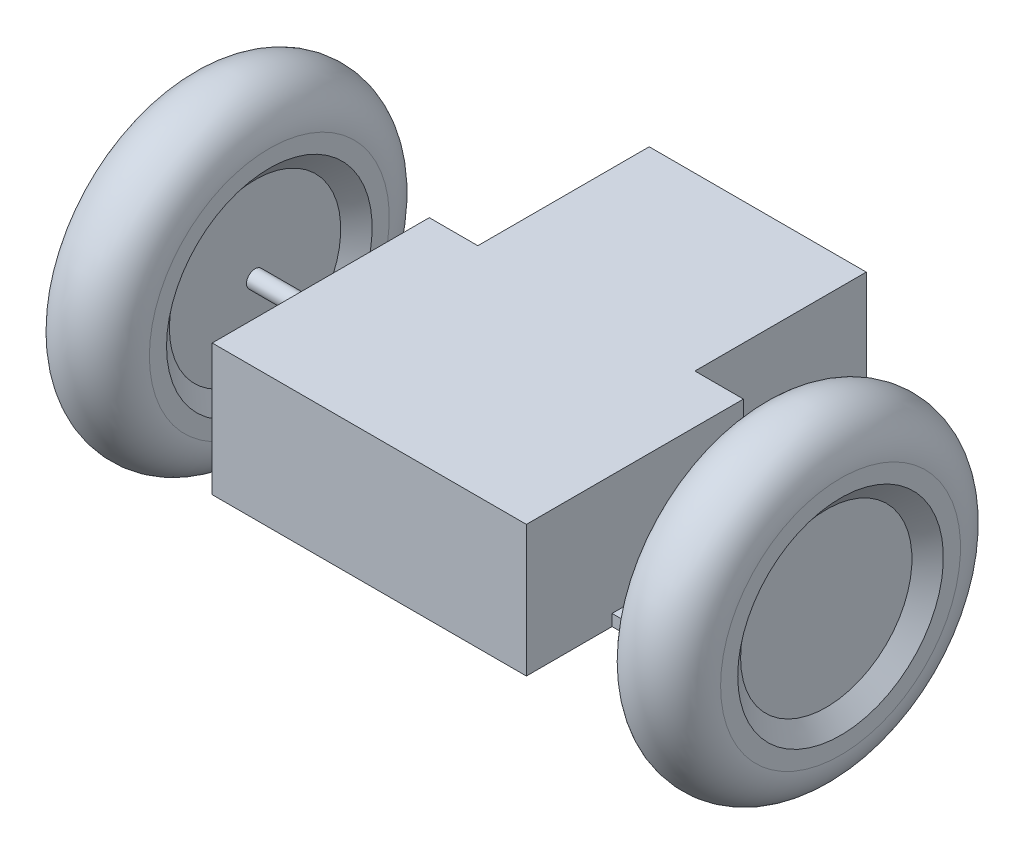
ISO-10303-21;
HEADER;
FILE_DESCRIPTION(('STEP AP214'),'2;1');
FILE_NAME('part.step','',(''),(''),'','','');
FILE_SCHEMA(('AUTOMOTIVE_DESIGN { 1 0 10303 214 1 1 1 1 }'));
ENDSEC;
DATA;
#1=APPLICATION_CONTEXT('core data for automotive mechanical design processes');
#2=APPLICATION_PROTOCOL_DEFINITION('international standard','automotive_design',2000,#1);
#3=PRODUCT_CONTEXT('',#1,'mechanical');
#4=PRODUCT('Part','Part','',(#3));
#5=PRODUCT_RELATED_PRODUCT_CATEGORY('part','',(#4));
#6=PRODUCT_DEFINITION_FORMATION('','',#4);
#7=PRODUCT_DEFINITION_CONTEXT('part definition',#1,'design');
#8=PRODUCT_DEFINITION('design','',#6,#7);
#9=PRODUCT_DEFINITION_SHAPE('','',#8);
#10=(LENGTH_UNIT() NAMED_UNIT(*) SI_UNIT(.MILLI.,.METRE.));
#11=(NAMED_UNIT(*) PLANE_ANGLE_UNIT() SI_UNIT($,.RADIAN.));
#12=(NAMED_UNIT(*) SI_UNIT($,.STERADIAN.) SOLID_ANGLE_UNIT());
#13=UNCERTAINTY_MEASURE_WITH_UNIT(LENGTH_MEASURE(1.E-05),#10,'distance_accuracy_value','');
#14=(GEOMETRIC_REPRESENTATION_CONTEXT(3) GLOBAL_UNCERTAINTY_ASSIGNED_CONTEXT((#13)) GLOBAL_UNIT_ASSIGNED_CONTEXT((#10,
#11,#12)) REPRESENTATION_CONTEXT('',''));
#15=CARTESIAN_POINT('',(0.,0.,0.));
#16=DIRECTION('',(0.,0.,1.));
#17=DIRECTION('',(1.,0.,0.));
#18=AXIS2_PLACEMENT_3D('',#15,#16,#17);
#19=CARTESIAN_POINT('',(27.5,-11.5,-34.));
#20=DIRECTION('',(1.,0.,0.));
#21=DIRECTION('',(0.,0.,-1.));
#22=AXIS2_PLACEMENT_3D('',#19,#20,#21);
#23=PLANE('',#22);
#24=DIRECTION('',(0.,-1.,0.));
#25=VECTOR('',#24,1.);
#26=CARTESIAN_POINT('',(27.5,-9.5,19.));
#27=LINE('',#26,#25);
#28=CARTESIAN_POINT('',(27.5,-9.5,19.));
#29=VERTEX_POINT('',#28);
#30=CARTESIAN_POINT('',(27.5,-11.5,19.));
#31=VERTEX_POINT('',#30);
#32=EDGE_CURVE('E56',#29,#31,#27,.T.);
#33=ORIENTED_EDGE('',*,*,#32,.F.);
#34=DIRECTION('',(0.,0.,-1.));
#35=VECTOR('',#34,1.);
#36=CARTESIAN_POINT('',(27.5,-9.5,19.));
#37=LINE('',#36,#35);
#38=CARTESIAN_POINT('',(27.5,-9.5,11.));
#39=VERTEX_POINT('',#38);
#40=EDGE_CURVE('E51',#29,#39,#37,.T.);
#41=ORIENTED_EDGE('',*,*,#40,.T.);
#42=DIRECTION('',(0.,-1.,0.));
#43=VECTOR('',#42,1.);
#44=CARTESIAN_POINT('',(27.5,-9.5,11.));
#45=LINE('',#44,#43);
#46=CARTESIAN_POINT('',(27.5,-11.5,11.));
#47=VERTEX_POINT('',#46);
#48=EDGE_CURVE('E160',#39,#47,#45,.T.);
#49=ORIENTED_EDGE('',*,*,#48,.T.);
#50=DIRECTION('',(0.,0.,-1.));
#51=VECTOR('',#50,1.);
#52=CARTESIAN_POINT('',(27.5,-11.5,-34.));
#53=LINE('',#52,#51);
#54=CARTESIAN_POINT('',(27.5,-11.5,-4.00000000000001));
#55=VERTEX_POINT('',#54);
#56=EDGE_CURVE('E315',#47,#55,#53,.T.);
#57=ORIENTED_EDGE('',*,*,#56,.T.);
#58=DIRECTION('',(0.,1.,0.));
#59=VECTOR('',#58,1.);
#60=CARTESIAN_POINT('',(27.5,-28.5,-4.00000000000001));
#61=LINE('',#60,#59);
#62=CARTESIAN_POINT('',(27.5,11.5,-4.00000000000001));
#63=VERTEX_POINT('',#62);
#64=EDGE_CURVE('E227',#55,#63,#61,.T.);
#65=ORIENTED_EDGE('',*,*,#64,.T.);
#66=DIRECTION('',(0.,0.,-1.));
#67=VECTOR('',#66,1.);
#68=CARTESIAN_POINT('',(27.5,11.5,-34.));
#69=LINE('',#68,#67);
#70=CARTESIAN_POINT('',(27.5,11.5,34.));
#71=VERTEX_POINT('',#70);
#72=EDGE_CURVE('E304',#71,#63,#69,.T.);
#73=ORIENTED_EDGE('',*,*,#72,.F.);
#74=DIRECTION('',(0.,1.,0.));
#75=VECTOR('',#74,1.);
#76=CARTESIAN_POINT('',(27.5,-11.5,34.));
#77=LINE('',#76,#75);
#78=CARTESIAN_POINT('',(27.5,-11.5,34.));
#79=VERTEX_POINT('',#78);
#80=EDGE_CURVE('E44',#79,#71,#77,.T.);
#81=ORIENTED_EDGE('',*,*,#80,.F.);
#82=EDGE_CURVE('E316',#79,#31,#53,.T.);
#83=ORIENTED_EDGE('',*,*,#82,.T.);
#84=EDGE_LOOP('',(#33,#41,#49,#57,#65,#73,#81,#83));
#85=FACE_BOUND('',#84,.T.);
#86=CARTESIAN_POINT('',(27.5,0.,9.));
#87=DIRECTION('',(1.,0.,0.));
#88=DIRECTION('',(0.,0.,-1.));
#89=AXIS2_PLACEMENT_3D('',#86,#87,#88);
#90=CIRCLE('',#89,1.5);
#91=CARTESIAN_POINT('',(27.5,0.,7.5));
#92=VERTEX_POINT('',#91);
#93=EDGE_CURVE('E296',#92,#92,#90,.T.);
#94=ORIENTED_EDGE('',*,*,#93,.F.);
#95=EDGE_LOOP('',(#94));
#96=FACE_BOUND('',#95,.T.);
#97=ADVANCED_FACE('F36',(#85,#96),#23,.T.);
#98=CARTESIAN_POINT('',(-27.5,-11.5,-34.));
#99=DIRECTION('',(-1.,0.,0.));
#100=DIRECTION('',(0.,0.,1.));
#101=AXIS2_PLACEMENT_3D('',#98,#99,#100);
#102=PLANE('',#101);
#103=DIRECTION('',(0.,-1.,0.));
#104=VECTOR('',#103,1.);
#105=CARTESIAN_POINT('',(-27.5,-9.5,11.));
#106=LINE('',#105,#104);
#107=CARTESIAN_POINT('',(-27.5,-9.5,11.));
#108=VERTEX_POINT('',#107);
#109=CARTESIAN_POINT('',(-27.5,-11.5,11.));
#110=VERTEX_POINT('',#109);
#111=EDGE_CURVE('E212',#108,#110,#106,.T.);
#112=ORIENTED_EDGE('',*,*,#111,.F.);
#113=DIRECTION('',(0.,0.,1.));
#114=VECTOR('',#113,1.);
#115=CARTESIAN_POINT('',(-27.5,-9.5,19.));
#116=LINE('',#115,#114);
#117=CARTESIAN_POINT('',(-27.5,-9.5,19.));
#118=VERTEX_POINT('',#117);
#119=EDGE_CURVE('E192',#108,#118,#116,.T.);
#120=ORIENTED_EDGE('',*,*,#119,.T.);
#121=DIRECTION('',(0.,-1.,0.));
#122=VECTOR('',#121,1.);
#123=CARTESIAN_POINT('',(-27.5,-9.5,19.));
#124=LINE('',#123,#122);
#125=CARTESIAN_POINT('',(-27.5,-11.5,19.));
#126=VERTEX_POINT('',#125);
#127=EDGE_CURVE('E204',#118,#126,#124,.T.);
#128=ORIENTED_EDGE('',*,*,#127,.T.);
#129=DIRECTION('',(0.,0.,1.));
#130=VECTOR('',#129,1.);
#131=CARTESIAN_POINT('',(-27.5,-11.5,-34.));
#132=LINE('',#131,#130);
#133=CARTESIAN_POINT('',(-27.5,-11.5,34.));
#134=VERTEX_POINT('',#133);
#135=EDGE_CURVE('E309',#126,#134,#132,.T.);
#136=ORIENTED_EDGE('',*,*,#135,.T.);
#137=DIRECTION('',(0.,1.,0.));
#138=VECTOR('',#137,1.);
#139=CARTESIAN_POINT('',(-27.5,-11.5,34.));
#140=LINE('',#139,#138);
#141=CARTESIAN_POINT('',(-27.5,11.5,34.));
#142=VERTEX_POINT('',#141);
#143=EDGE_CURVE('E320',#134,#142,#140,.T.);
#144=ORIENTED_EDGE('',*,*,#143,.T.);
#145=DIRECTION('',(0.,0.,1.));
#146=VECTOR('',#145,1.);
#147=CARTESIAN_POINT('',(-27.5,11.5,-34.));
#148=LINE('',#147,#146);
#149=CARTESIAN_POINT('',(-27.5,11.5,-4.00000000000001));
#150=VERTEX_POINT('',#149);
#151=EDGE_CURVE('E299',#150,#142,#148,.T.);
#152=ORIENTED_EDGE('',*,*,#151,.F.);
#153=DIRECTION('',(0.,1.,0.));
#154=VECTOR('',#153,1.);
#155=CARTESIAN_POINT('',(-27.5,-28.5,-4.00000000000001));
#156=LINE('',#155,#154);
#157=CARTESIAN_POINT('',(-27.5,-11.5,-4.00000000000001));
#158=VERTEX_POINT('',#157);
#159=EDGE_CURVE('E243',#158,#150,#156,.T.);
#160=ORIENTED_EDGE('',*,*,#159,.F.);
#161=EDGE_CURVE('E310',#158,#110,#132,.T.);
#162=ORIENTED_EDGE('',*,*,#161,.T.);
#163=EDGE_LOOP('',(#112,#120,#128,#136,#144,#152,#160,#162));
#164=FACE_BOUND('',#163,.T.);
#165=CARTESIAN_POINT('',(-27.5,0.,9.));
#166=DIRECTION('',(-1.,0.,0.));
#167=DIRECTION('',(0.,0.,1.));
#168=AXIS2_PLACEMENT_3D('',#165,#166,#167);
#169=CIRCLE('',#168,1.5);
#170=CARTESIAN_POINT('',(-27.5,0.,10.5));
#171=VERTEX_POINT('',#170);
#172=EDGE_CURVE('E11',#171,#171,#169,.T.);
#173=ORIENTED_EDGE('',*,*,#172,.F.);
#174=EDGE_LOOP('',(#173));
#175=FACE_BOUND('',#174,.T.);
#176=ADVANCED_FACE('F38',(#164,#175),#102,.T.);
#177=CARTESIAN_POINT('',(27.5,-11.5,-34.));
#178=DIRECTION('',(0.,0.,-1.));
#179=DIRECTION('',(-1.,0.,0.));
#180=AXIS2_PLACEMENT_3D('',#177,#178,#179);
#181=PLANE('',#180);
#182=DIRECTION('',(0.,1.,0.));
#183=VECTOR('',#182,1.);
#184=CARTESIAN_POINT('',(19.,-28.5,-34.));
#185=LINE('',#184,#183);
#186=CARTESIAN_POINT('',(19.,-11.5,-34.));
#187=VERTEX_POINT('',#186);
#188=CARTESIAN_POINT('',(19.,11.5,-34.));
#189=VERTEX_POINT('',#188);
#190=EDGE_CURVE('E226',#187,#189,#185,.T.);
#191=ORIENTED_EDGE('',*,*,#190,.F.);
#192=DIRECTION('',(-1.,0.,0.));
#193=VECTOR('',#192,1.);
#194=CARTESIAN_POINT('',(27.5,-11.5,-34.));
#195=LINE('',#194,#193);
#196=CARTESIAN_POINT('',(-19.,-11.5,-34.));
#197=VERTEX_POINT('',#196);
#198=EDGE_CURVE('E318',#187,#197,#195,.T.);
#199=ORIENTED_EDGE('',*,*,#198,.T.);
#200=DIRECTION('',(0.,1.,0.));
#201=VECTOR('',#200,1.);
#202=CARTESIAN_POINT('',(-19.,-28.5,-34.));
#203=LINE('',#202,#201);
#204=CARTESIAN_POINT('',(-19.,11.5,-34.));
#205=VERTEX_POINT('',#204);
#206=EDGE_CURVE('E244',#197,#205,#203,.T.);
#207=ORIENTED_EDGE('',*,*,#206,.T.);
#208=DIRECTION('',(-1.,0.,0.));
#209=VECTOR('',#208,1.);
#210=CARTESIAN_POINT('',(27.5,11.5,-34.));
#211=LINE('',#210,#209);
#212=EDGE_CURVE('E307',#189,#205,#211,.T.);
#213=ORIENTED_EDGE('',*,*,#212,.F.);
#214=EDGE_LOOP('',(#191,#199,#207,#213));
#215=FACE_BOUND('',#214,.T.);
#216=ADVANCED_FACE('F355',(#215),#181,.T.);
#217=CARTESIAN_POINT('',(27.5,-11.5,34.));
#218=DIRECTION('',(0.,0.,1.));
#219=DIRECTION('',(1.,0.,0.));
#220=AXIS2_PLACEMENT_3D('',#217,#218,#219);
#221=PLANE('',#220);
#222=ORIENTED_EDGE('',*,*,#80,.T.);
#223=DIRECTION('',(1.,0.,0.));
#224=VECTOR('',#223,1.);
#225=CARTESIAN_POINT('',(27.5,11.5,34.));
#226=LINE('',#225,#224);
#227=EDGE_CURVE('E301',#142,#71,#226,.T.);
#228=ORIENTED_EDGE('',*,*,#227,.F.);
#229=ORIENTED_EDGE('',*,*,#143,.F.);
#230=DIRECTION('',(1.,0.,0.));
#231=VECTOR('',#230,1.);
#232=CARTESIAN_POINT('',(27.5,-11.5,34.));
#233=LINE('',#232,#231);
#234=EDGE_CURVE('E312',#134,#79,#233,.T.);
#235=ORIENTED_EDGE('',*,*,#234,.T.);
#236=EDGE_LOOP('',(#222,#228,#229,#235));
#237=FACE_BOUND('',#236,.T.);
#238=ADVANCED_FACE('F330',(#237),#221,.T.);
#239=CARTESIAN_POINT('',(0.,-11.5,0.));
#240=DIRECTION('',(0.,-1.,0.));
#241=DIRECTION('',(0.,0.,-1.));
#242=AXIS2_PLACEMENT_3D('',#239,#240,#241);
#243=PLANE('',#242);
#244=DIRECTION('',(-1.,0.,0.));
#245=VECTOR('',#244,1.);
#246=CARTESIAN_POINT('',(0.,-11.5,-4.00000000000001));
#247=LINE('',#246,#245);
#248=CARTESIAN_POINT('',(19.,-11.5,-4.00000000000001));
#249=VERTEX_POINT('',#248);
#250=EDGE_CURVE('E235',#55,#249,#247,.T.);
#251=ORIENTED_EDGE('',*,*,#250,.F.);
#252=ORIENTED_EDGE('',*,*,#56,.F.);
#253=DIRECTION('',(1.,0.,0.));
#254=VECTOR('',#253,1.);
#255=CARTESIAN_POINT('',(27.5,-11.5,11.));
#256=LINE('',#255,#254);
#257=CARTESIAN_POINT('',(32.5,-11.5,11.));
#258=VERTEX_POINT('',#257);
#259=EDGE_CURVE('E176',#47,#258,#256,.T.);
#260=ORIENTED_EDGE('',*,*,#259,.T.);
#261=DIRECTION('',(0.,0.,1.));
#262=VECTOR('',#261,1.);
#263=CARTESIAN_POINT('',(32.5,-11.5,19.));
#264=LINE('',#263,#262);
#265=CARTESIAN_POINT('',(32.5,-11.5,19.));
#266=VERTEX_POINT('',#265);
#267=EDGE_CURVE('E154',#258,#266,#264,.T.);
#268=ORIENTED_EDGE('',*,*,#267,.T.);
#269=DIRECTION('',(-1.,0.,0.));
#270=VECTOR('',#269,1.);
#271=CARTESIAN_POINT('',(27.5,-11.5,19.));
#272=LINE('',#271,#270);
#273=EDGE_CURVE('E171',#266,#31,#272,.T.);
#274=ORIENTED_EDGE('',*,*,#273,.T.);
#275=ORIENTED_EDGE('',*,*,#82,.F.);
#276=ORIENTED_EDGE('',*,*,#234,.F.);
#277=ORIENTED_EDGE('',*,*,#135,.F.);
#278=DIRECTION('',(-1.,0.,0.));
#279=VECTOR('',#278,1.);
#280=CARTESIAN_POINT('',(-27.5,-11.5,19.));
#281=LINE('',#280,#279);
#282=CARTESIAN_POINT('',(-32.5,-11.5,19.));
#283=VERTEX_POINT('',#282);
#284=EDGE_CURVE('E189',#126,#283,#281,.T.);
#285=ORIENTED_EDGE('',*,*,#284,.T.);
#286=DIRECTION('',(0.,0.,-1.));
#287=VECTOR('',#286,1.);
#288=CARTESIAN_POINT('',(-32.5,-11.5,19.));
#289=LINE('',#288,#287);
#290=CARTESIAN_POINT('',(-32.5,-11.5,11.));
#291=VERTEX_POINT('',#290);
#292=EDGE_CURVE('E207',#283,#291,#289,.T.);
#293=ORIENTED_EDGE('',*,*,#292,.T.);
#294=DIRECTION('',(1.,0.,0.));
#295=VECTOR('',#294,1.);
#296=CARTESIAN_POINT('',(-27.5,-11.5,11.));
#297=LINE('',#296,#295);
#298=EDGE_CURVE('E195',#291,#110,#297,.T.);
#299=ORIENTED_EDGE('',*,*,#298,.T.);
#300=ORIENTED_EDGE('',*,*,#161,.F.);
#301=DIRECTION('',(-1.,0.,0.));
#302=VECTOR('',#301,1.);
#303=CARTESIAN_POINT('',(0.,-11.5,-4.00000000000001));
#304=LINE('',#303,#302);
#305=CARTESIAN_POINT('',(-19.,-11.5,-4.00000000000001));
#306=VERTEX_POINT('',#305);
#307=EDGE_CURVE('E247',#306,#158,#304,.T.);
#308=ORIENTED_EDGE('',*,*,#307,.F.);
#309=DIRECTION('',(0.,0.,1.));
#310=VECTOR('',#309,1.);
#311=CARTESIAN_POINT('',(-19.,-11.5,0.));
#312=LINE('',#311,#310);
#313=EDGE_CURVE('E252',#197,#306,#312,.T.);
#314=ORIENTED_EDGE('',*,*,#313,.F.);
#315=ORIENTED_EDGE('',*,*,#198,.F.);
#316=DIRECTION('',(0.,0.,-1.));
#317=VECTOR('',#316,1.);
#318=CARTESIAN_POINT('',(19.,-11.5,0.));
#319=LINE('',#318,#317);
#320=EDGE_CURVE('E230',#249,#187,#319,.T.);
#321=ORIENTED_EDGE('',*,*,#320,.F.);
#322=EDGE_LOOP('',(#251,#252,#260,#268,#274,#275,#276,#277,#285,#293,#299,#300,#308,#314,#315,#321));
#323=FACE_BOUND('',#322,.T.);
#324=CARTESIAN_POINT('',(-30.,-11.5,15.));
#325=DIRECTION('',(0.,-1.,0.));
#326=DIRECTION('',(0.,0.,-1.));
#327=AXIS2_PLACEMENT_3D('',#324,#325,#326);
#328=CIRCLE('',#327,1.5);
#329=CARTESIAN_POINT('',(-30.,-11.5,13.5));
#330=VERTEX_POINT('',#329);
#331=EDGE_CURVE('E183',#330,#330,#328,.T.);
#332=ORIENTED_EDGE('',*,*,#331,.F.);
#333=EDGE_LOOP('',(#332));
#334=FACE_BOUND('',#333,.T.);
#335=CARTESIAN_POINT('',(30.,-11.5,15.));
#336=DIRECTION('',(0.,-1.,0.));
#337=DIRECTION('',(0.,0.,-1.));
#338=AXIS2_PLACEMENT_3D('',#335,#336,#337);
#339=CIRCLE('',#338,1.5);
#340=CARTESIAN_POINT('',(30.,-11.5,13.5));
#341=VERTEX_POINT('',#340);
#342=EDGE_CURVE('E696',#341,#341,#339,.T.);
#343=ORIENTED_EDGE('',*,*,#342,.F.);
#344=EDGE_LOOP('',(#343));
#345=FACE_BOUND('',#344,.T.);
#346=ADVANCED_FACE('F345',(#323,#334,#345),#243,.T.);
#347=CARTESIAN_POINT('',(0.,11.5,0.));
#348=DIRECTION('',(0.,-1.,0.));
#349=DIRECTION('',(0.,0.,-1.));
#350=AXIS2_PLACEMENT_3D('',#347,#348,#349);
#351=PLANE('',#350);
#352=ORIENTED_EDGE('',*,*,#72,.T.);
#353=DIRECTION('',(1.,0.,0.));
#354=VECTOR('',#353,1.);
#355=CARTESIAN_POINT('',(27.5,11.5,-4.00000000000001));
#356=LINE('',#355,#354);
#357=CARTESIAN_POINT('',(19.,11.5,-4.00000000000001));
#358=VERTEX_POINT('',#357);
#359=EDGE_CURVE('E224',#358,#63,#356,.T.);
#360=ORIENTED_EDGE('',*,*,#359,.F.);
#361=DIRECTION('',(0.,0.,1.));
#362=VECTOR('',#361,1.);
#363=CARTESIAN_POINT('',(19.,11.5,-34.));
#364=LINE('',#363,#362);
#365=EDGE_CURVE('E215',#189,#358,#364,.T.);
#366=ORIENTED_EDGE('',*,*,#365,.F.);
#367=ORIENTED_EDGE('',*,*,#212,.T.);
#368=DIRECTION('',(0.,0.,-1.));
#369=VECTOR('',#368,1.);
#370=CARTESIAN_POINT('',(-19.,11.5,-34.));
#371=LINE('',#370,#369);
#372=CARTESIAN_POINT('',(-19.,11.5,-4.00000000000001));
#373=VERTEX_POINT('',#372);
#374=EDGE_CURVE('E240',#373,#205,#371,.T.);
#375=ORIENTED_EDGE('',*,*,#374,.F.);
#376=DIRECTION('',(1.,0.,0.));
#377=VECTOR('',#376,1.);
#378=CARTESIAN_POINT('',(-27.5,11.5,-4.00000000000001));
#379=LINE('',#378,#377);
#380=EDGE_CURVE('E237',#150,#373,#379,.T.);
#381=ORIENTED_EDGE('',*,*,#380,.F.);
#382=ORIENTED_EDGE('',*,*,#151,.T.);
#383=ORIENTED_EDGE('',*,*,#227,.T.);
#384=EDGE_LOOP('',(#352,#360,#366,#367,#375,#381,#382,#383));
#385=FACE_BOUND('',#384,.T.);
#386=ADVANCED_FACE('F333',(#385),#351,.F.);
#387=CARTESIAN_POINT('',(42.5,0.,9.));
#388=DIRECTION('',(-1.,0.,0.));
#389=DIRECTION('',(0.,0.,1.));
#390=AXIS2_PLACEMENT_3D('',#387,#388,#389);
#391=CYLINDRICAL_SURFACE('',#390,1.5);
#392=ORIENTED_EDGE('',*,*,#93,.T.);
#393=EDGE_LOOP('',(#392));
#394=FACE_BOUND('',#393,.T.);
#395=CARTESIAN_POINT('',(45.,0.,9.));
#396=DIRECTION('',(-1.,0.,0.));
#397=DIRECTION('',(0.,0.,1.));
#398=AXIS2_PLACEMENT_3D('',#395,#396,#397);
#399=CIRCLE('',#398,1.5);
#400=CARTESIAN_POINT('',(45.,0.,10.5));
#401=VERTEX_POINT('',#400);
#402=EDGE_CURVE('E293',#401,#401,#399,.T.);
#403=ORIENTED_EDGE('',*,*,#402,.T.);
#404=EDGE_LOOP('',(#403));
#405=FACE_BOUND('',#404,.T.);
#406=ADVANCED_FACE('F450',(#394,#405),#391,.T.);
#407=CARTESIAN_POINT('',(45.,0.,7.5));
#408=DIRECTION('',(1.,0.,0.));
#409=DIRECTION('',(0.,0.,-1.));
#410=AXIS2_PLACEMENT_3D('',#407,#408,#409);
#411=PLANE('',#410);
#412=ORIENTED_EDGE('',*,*,#402,.F.);
#413=EDGE_LOOP('',(#412));
#414=FACE_BOUND('',#413,.T.);
#415=CARTESIAN_POINT('',(45.,0.,9.));
#416=DIRECTION('',(-1.,0.,0.));
#417=DIRECTION('',(0.,0.,1.));
#418=AXIS2_PLACEMENT_3D('',#415,#416,#417);
#419=CIRCLE('',#418,15.);
#420=CARTESIAN_POINT('',(45.,0.,24.));
#421=VERTEX_POINT('',#420);
#422=EDGE_CURVE('E290',#421,#421,#419,.T.);
#423=ORIENTED_EDGE('',*,*,#422,.T.);
#424=EDGE_LOOP('',(#423));
#425=FACE_BOUND('',#424,.T.);
#426=ADVANCED_FACE('F453',(#414,#425),#411,.F.);
#427=CARTESIAN_POINT('',(42.5,0.,9.));
#428=DIRECTION('',(-1.,0.,0.));
#429=DIRECTION('',(0.,0.,1.));
#430=AXIS2_PLACEMENT_3D('',#427,#428,#429);
#431=CONICAL_SURFACE('',#430,18.,0.876058050598195);
#432=ORIENTED_EDGE('',*,*,#422,.F.);
#433=EDGE_LOOP('',(#432));
#434=FACE_BOUND('',#433,.T.);
#435=CARTESIAN_POINT('',(42.5,0.,9.));
#436=DIRECTION('',(-1.,0.,0.));
#437=DIRECTION('',(0.,0.,1.));
#438=AXIS2_PLACEMENT_3D('',#435,#436,#437);
#439=CIRCLE('',#438,18.);
#440=CARTESIAN_POINT('',(42.5,0.,27.));
#441=VERTEX_POINT('',#440);
#442=EDGE_CURVE('E287',#441,#441,#439,.T.);
#443=ORIENTED_EDGE('',*,*,#442,.T.);
#444=EDGE_LOOP('',(#443));
#445=FACE_BOUND('',#444,.T.);
#446=ADVANCED_FACE('F465',(#434,#445),#431,.F.);
#447=CARTESIAN_POINT('',(42.5,0.,-9.00000000000001));
#448=DIRECTION('',(1.,0.,0.));
#449=DIRECTION('',(0.,0.,-1.));
#450=AXIS2_PLACEMENT_3D('',#447,#448,#449);
#451=PLANE('',#450);
#452=ORIENTED_EDGE('',*,*,#442,.F.);
#453=EDGE_LOOP('',(#452));
#454=FACE_BOUND('',#453,.T.);
#455=CARTESIAN_POINT('',(42.5,0.,9.));
#456=DIRECTION('',(-1.,0.,0.));
#457=DIRECTION('',(0.,0.,1.));
#458=AXIS2_PLACEMENT_3D('',#455,#456,#457);
#459=CIRCLE('',#458,21.);
#460=CARTESIAN_POINT('',(42.5,0.,30.));
#461=VERTEX_POINT('',#460);
#462=EDGE_CURVE('E284',#461,#461,#459,.T.);
#463=ORIENTED_EDGE('',*,*,#462,.T.);
#464=EDGE_LOOP('',(#463));
#465=FACE_BOUND('',#464,.T.);
#466=ADVANCED_FACE('F473',(#454,#465),#451,.F.);
#467=CARTESIAN_POINT('',(50.,0.,8.99999999999999));
#468=DIRECTION('',(-1.,0.,0.));
#469=DIRECTION('',(0.,0.,1.));
#470=AXIS2_PLACEMENT_3D('',#467,#468,#469);
#471=TOROIDAL_SURFACE('',#470,21.,7.5);
#472=ORIENTED_EDGE('',*,*,#462,.F.);
#473=EDGE_LOOP('',(#472));
#474=FACE_BOUND('',#473,.T.);
#475=CARTESIAN_POINT('',(57.5,0.,9.));
#476=DIRECTION('',(-1.,0.,0.));
#477=DIRECTION('',(0.,0.,1.));
#478=AXIS2_PLACEMENT_3D('',#475,#476,#477);
#479=CIRCLE('',#478,21.);
#480=CARTESIAN_POINT('',(57.5,0.,30.));
#481=VERTEX_POINT('',#480);
#482=EDGE_CURVE('E281',#481,#481,#479,.T.);
#483=ORIENTED_EDGE('',*,*,#482,.T.);
#484=EDGE_LOOP('',(#483));
#485=FACE_BOUND('',#484,.T.);
#486=ADVANCED_FACE('F481',(#474,#485),#471,.T.);
#487=CARTESIAN_POINT('',(57.5,0.,-12.));
#488=DIRECTION('',(-1.,0.,0.));
#489=DIRECTION('',(0.,0.,1.));
#490=AXIS2_PLACEMENT_3D('',#487,#488,#489);
#491=PLANE('',#490);
#492=ORIENTED_EDGE('',*,*,#482,.F.);
#493=EDGE_LOOP('',(#492));
#494=FACE_BOUND('',#493,.T.);
#495=CARTESIAN_POINT('',(57.5,0.,9.));
#496=DIRECTION('',(-1.,0.,0.));
#497=DIRECTION('',(0.,0.,1.));
#498=AXIS2_PLACEMENT_3D('',#495,#496,#497);
#499=CIRCLE('',#498,18.);
#500=CARTESIAN_POINT('',(57.5,0.,27.));
#501=VERTEX_POINT('',#500);
#502=EDGE_CURVE('E278',#501,#501,#499,.T.);
#503=ORIENTED_EDGE('',*,*,#502,.T.);
#504=EDGE_LOOP('',(#503));
#505=FACE_BOUND('',#504,.T.);
#506=ADVANCED_FACE('F490',(#494,#505),#491,.F.);
#507=CARTESIAN_POINT('',(55.,0.,9.));
#508=DIRECTION('',(1.,0.,0.));
#509=DIRECTION('',(0.,0.,-1.));
#510=AXIS2_PLACEMENT_3D('',#507,#508,#509);
#511=CONICAL_SURFACE('',#510,15.,0.876058050598195);
#512=ORIENTED_EDGE('',*,*,#502,.F.);
#513=EDGE_LOOP('',(#512));
#514=FACE_BOUND('',#513,.T.);
#515=CARTESIAN_POINT('',(55.,0.,9.));
#516=DIRECTION('',(-1.,0.,0.));
#517=DIRECTION('',(0.,0.,1.));
#518=AXIS2_PLACEMENT_3D('',#515,#516,#517);
#519=CIRCLE('',#518,15.);
#520=CARTESIAN_POINT('',(55.,0.,24.));
#521=VERTEX_POINT('',#520);
#522=EDGE_CURVE('E275',#521,#521,#519,.T.);
#523=ORIENTED_EDGE('',*,*,#522,.T.);
#524=EDGE_LOOP('',(#523));
#525=FACE_BOUND('',#524,.T.);
#526=ADVANCED_FACE('F498',(#514,#525),#511,.F.);
#527=CARTESIAN_POINT('',(55.,0.,-6.00000000000001));
#528=DIRECTION('',(-1.,0.,0.));
#529=DIRECTION('',(0.,0.,1.));
#530=AXIS2_PLACEMENT_3D('',#527,#528,#529);
#531=PLANE('',#530);
#532=ORIENTED_EDGE('',*,*,#522,.F.);
#533=EDGE_LOOP('',(#532));
#534=FACE_BOUND('',#533,.T.);
#535=ADVANCED_FACE('F440',(#534),#531,.F.);
#536=CARTESIAN_POINT('',(-42.5,0.,9.));
#537=DIRECTION('',(1.,0.,0.));
#538=DIRECTION('',(0.,0.,-1.));
#539=AXIS2_PLACEMENT_3D('',#536,#537,#538);
#540=CYLINDRICAL_SURFACE('',#539,1.5);
#541=ORIENTED_EDGE('',*,*,#172,.T.);
#542=EDGE_LOOP('',(#541));
#543=FACE_BOUND('',#542,.T.);
#544=CARTESIAN_POINT('',(-45.,0.,9.));
#545=DIRECTION('',(-1.,0.,0.));
#546=DIRECTION('',(0.,0.,1.));
#547=AXIS2_PLACEMENT_3D('',#544,#545,#546);
#548=CIRCLE('',#547,1.5);
#549=CARTESIAN_POINT('',(-45.,0.,10.5));
#550=VERTEX_POINT('',#549);
#551=EDGE_CURVE('E272',#550,#550,#548,.T.);
#552=ORIENTED_EDGE('',*,*,#551,.F.);
#553=EDGE_LOOP('',(#552));
#554=FACE_BOUND('',#553,.T.);
#555=ADVANCED_FACE('F434',(#543,#554),#540,.T.);
#556=CARTESIAN_POINT('',(-45.,0.,7.5));
#557=DIRECTION('',(-1.,0.,0.));
#558=DIRECTION('',(0.,0.,-1.));
#559=AXIS2_PLACEMENT_3D('',#556,#557,#558);
#560=PLANE('',#559);
#561=ORIENTED_EDGE('',*,*,#551,.T.);
#562=EDGE_LOOP('',(#561));
#563=FACE_BOUND('',#562,.T.);
#564=CARTESIAN_POINT('',(-45.,0.,9.));
#565=DIRECTION('',(-1.,0.,0.));
#566=DIRECTION('',(0.,0.,1.));
#567=AXIS2_PLACEMENT_3D('',#564,#565,#566);
#568=CIRCLE('',#567,15.);
#569=CARTESIAN_POINT('',(-45.,0.,24.));
#570=VERTEX_POINT('',#569);
#571=EDGE_CURVE('E269',#570,#570,#568,.T.);
#572=ORIENTED_EDGE('',*,*,#571,.F.);
#573=EDGE_LOOP('',(#572));
#574=FACE_BOUND('',#573,.T.);
#575=ADVANCED_FACE('F439',(#563,#574),#560,.F.);
#576=CARTESIAN_POINT('',(-42.5,0.,9.));
#577=DIRECTION('',(1.,0.,0.));
#578=DIRECTION('',(0.,0.,1.));
#579=AXIS2_PLACEMENT_3D('',#576,#577,#578);
#580=CONICAL_SURFACE('',#579,18.,0.876058050598195);
#581=ORIENTED_EDGE('',*,*,#571,.T.);
#582=EDGE_LOOP('',(#581));
#583=FACE_BOUND('',#582,.T.);
#584=CARTESIAN_POINT('',(-42.5,0.,9.));
#585=DIRECTION('',(-1.,0.,0.));
#586=DIRECTION('',(0.,0.,1.));
#587=AXIS2_PLACEMENT_3D('',#584,#585,#586);
#588=CIRCLE('',#587,18.);
#589=CARTESIAN_POINT('',(-42.5,0.,27.));
#590=VERTEX_POINT('',#589);
#591=EDGE_CURVE('E266',#590,#590,#588,.T.);
#592=ORIENTED_EDGE('',*,*,#591,.F.);
#593=EDGE_LOOP('',(#592));
#594=FACE_BOUND('',#593,.T.);
#595=ADVANCED_FACE('F527',(#583,#594),#580,.F.);
#596=CARTESIAN_POINT('',(-42.5,0.,-9.00000000000001));
#597=DIRECTION('',(-1.,0.,0.));
#598=DIRECTION('',(0.,0.,-1.));
#599=AXIS2_PLACEMENT_3D('',#596,#597,#598);
#600=PLANE('',#599);
#601=ORIENTED_EDGE('',*,*,#591,.T.);
#602=EDGE_LOOP('',(#601));
#603=FACE_BOUND('',#602,.T.);
#604=CARTESIAN_POINT('',(-42.5,0.,9.));
#605=DIRECTION('',(-1.,0.,0.));
#606=DIRECTION('',(0.,0.,1.));
#607=AXIS2_PLACEMENT_3D('',#604,#605,#606);
#608=CIRCLE('',#607,21.);
#609=CARTESIAN_POINT('',(-42.5,0.,30.));
#610=VERTEX_POINT('',#609);
#611=EDGE_CURVE('E263',#610,#610,#608,.T.);
#612=ORIENTED_EDGE('',*,*,#611,.F.);
#613=EDGE_LOOP('',(#612));
#614=FACE_BOUND('',#613,.T.);
#615=ADVANCED_FACE('F536',(#603,#614),#600,.F.);
#616=CARTESIAN_POINT('',(-50.,0.,8.99999999999999));
#617=DIRECTION('',(1.,0.,0.));
#618=DIRECTION('',(0.,0.,1.));
#619=AXIS2_PLACEMENT_3D('',#616,#617,#618);
#620=TOROIDAL_SURFACE('',#619,21.,7.5);
#621=ORIENTED_EDGE('',*,*,#611,.T.);
#622=EDGE_LOOP('',(#621));
#623=FACE_BOUND('',#622,.T.);
#624=CARTESIAN_POINT('',(-57.5,0.,9.));
#625=DIRECTION('',(-1.,0.,0.));
#626=DIRECTION('',(0.,0.,1.));
#627=AXIS2_PLACEMENT_3D('',#624,#625,#626);
#628=CIRCLE('',#627,21.);
#629=CARTESIAN_POINT('',(-57.5,0.,30.));
#630=VERTEX_POINT('',#629);
#631=EDGE_CURVE('E260',#630,#630,#628,.T.);
#632=ORIENTED_EDGE('',*,*,#631,.F.);
#633=EDGE_LOOP('',(#632));
#634=FACE_BOUND('',#633,.T.);
#635=ADVANCED_FACE('F545',(#623,#634),#620,.T.);
#636=CARTESIAN_POINT('',(-57.5,0.,-12.));
#637=DIRECTION('',(1.,0.,0.));
#638=DIRECTION('',(0.,0.,1.));
#639=AXIS2_PLACEMENT_3D('',#636,#637,#638);
#640=PLANE('',#639);
#641=ORIENTED_EDGE('',*,*,#631,.T.);
#642=EDGE_LOOP('',(#641));
#643=FACE_BOUND('',#642,.T.);
#644=CARTESIAN_POINT('',(-57.5,0.,9.));
#645=DIRECTION('',(-1.,0.,0.));
#646=DIRECTION('',(0.,0.,1.));
#647=AXIS2_PLACEMENT_3D('',#644,#645,#646);
#648=CIRCLE('',#647,18.);
#649=CARTESIAN_POINT('',(-57.5,0.,27.));
#650=VERTEX_POINT('',#649);
#651=EDGE_CURVE('E257',#650,#650,#648,.T.);
#652=ORIENTED_EDGE('',*,*,#651,.F.);
#653=EDGE_LOOP('',(#652));
#654=FACE_BOUND('',#653,.T.);
#655=ADVANCED_FACE('F554',(#643,#654),#640,.F.);
#656=CARTESIAN_POINT('',(-55.,0.,9.));
#657=DIRECTION('',(-1.,0.,0.));
#658=DIRECTION('',(0.,0.,-1.));
#659=AXIS2_PLACEMENT_3D('',#656,#657,#658);
#660=CONICAL_SURFACE('',#659,15.,0.876058050598195);
#661=ORIENTED_EDGE('',*,*,#651,.T.);
#662=EDGE_LOOP('',(#661));
#663=FACE_BOUND('',#662,.T.);
#664=CARTESIAN_POINT('',(-55.,0.,9.));
#665=DIRECTION('',(-1.,0.,0.));
#666=DIRECTION('',(0.,0.,1.));
#667=AXIS2_PLACEMENT_3D('',#664,#665,#666);
#668=CIRCLE('',#667,15.);
#669=CARTESIAN_POINT('',(-55.,0.,24.));
#670=VERTEX_POINT('',#669);
#671=EDGE_CURVE('E254',#670,#670,#668,.T.);
#672=ORIENTED_EDGE('',*,*,#671,.F.);
#673=EDGE_LOOP('',(#672));
#674=FACE_BOUND('',#673,.T.);
#675=ADVANCED_FACE('F563',(#663,#674),#660,.F.);
#676=CARTESIAN_POINT('',(-55.,0.,-6.00000000000001));
#677=DIRECTION('',(1.,0.,0.));
#678=DIRECTION('',(0.,0.,1.));
#679=AXIS2_PLACEMENT_3D('',#676,#677,#678);
#680=PLANE('',#679);
#681=ORIENTED_EDGE('',*,*,#671,.T.);
#682=EDGE_LOOP('',(#681));
#683=FACE_BOUND('',#682,.T.);
#684=ADVANCED_FACE('F572',(#683),#680,.F.);
#685=CARTESIAN_POINT('',(-19.,-28.5,-34.));
#686=DIRECTION('',(1.,0.,0.));
#687=DIRECTION('',(0.,0.,-1.));
#688=AXIS2_PLACEMENT_3D('',#685,#686,#687);
#689=PLANE('',#688);
#690=ORIENTED_EDGE('',*,*,#313,.T.);
#691=DIRECTION('',(0.,1.,0.));
#692=VECTOR('',#691,1.);
#693=CARTESIAN_POINT('',(-19.,-28.5,-4.00000000000001));
#694=LINE('',#693,#692);
#695=EDGE_CURVE('E248',#306,#373,#694,.T.);
#696=ORIENTED_EDGE('',*,*,#695,.T.);
#697=ORIENTED_EDGE('',*,*,#374,.T.);
#698=ORIENTED_EDGE('',*,*,#206,.F.);
#699=EDGE_LOOP('',(#690,#696,#697,#698));
#700=FACE_BOUND('',#699,.T.);
#701=ADVANCED_FACE('F359',(#700),#689,.F.);
#702=CARTESIAN_POINT('',(-27.5,-28.5,-4.00000000000001));
#703=DIRECTION('',(0.,0.,1.));
#704=DIRECTION('',(1.,0.,0.));
#705=AXIS2_PLACEMENT_3D('',#702,#703,#704);
#706=PLANE('',#705);
#707=ORIENTED_EDGE('',*,*,#307,.T.);
#708=ORIENTED_EDGE('',*,*,#159,.T.);
#709=ORIENTED_EDGE('',*,*,#380,.T.);
#710=ORIENTED_EDGE('',*,*,#695,.F.);
#711=EDGE_LOOP('',(#707,#708,#709,#710));
#712=FACE_BOUND('',#711,.T.);
#713=ADVANCED_FACE('F363',(#712),#706,.F.);
#714=CARTESIAN_POINT('',(27.5,-28.5,-4.00000000000001));
#715=DIRECTION('',(0.,0.,1.));
#716=DIRECTION('',(1.,0.,0.));
#717=AXIS2_PLACEMENT_3D('',#714,#715,#716);
#718=PLANE('',#717);
#719=ORIENTED_EDGE('',*,*,#250,.T.);
#720=DIRECTION('',(0.,1.,0.));
#721=VECTOR('',#720,1.);
#722=CARTESIAN_POINT('',(19.,-28.5,-4.00000000000001));
#723=LINE('',#722,#721);
#724=EDGE_CURVE('E231',#249,#358,#723,.T.);
#725=ORIENTED_EDGE('',*,*,#724,.T.);
#726=ORIENTED_EDGE('',*,*,#359,.T.);
#727=ORIENTED_EDGE('',*,*,#64,.F.);
#728=EDGE_LOOP('',(#719,#725,#726,#727));
#729=FACE_BOUND('',#728,.T.);
#730=ADVANCED_FACE('F341',(#729),#718,.F.);
#731=CARTESIAN_POINT('',(19.,-28.5,-34.));
#732=DIRECTION('',(-1.,0.,0.));
#733=DIRECTION('',(0.,0.,1.));
#734=AXIS2_PLACEMENT_3D('',#731,#732,#733);
#735=PLANE('',#734);
#736=ORIENTED_EDGE('',*,*,#320,.T.);
#737=ORIENTED_EDGE('',*,*,#190,.T.);
#738=ORIENTED_EDGE('',*,*,#365,.T.);
#739=ORIENTED_EDGE('',*,*,#724,.F.);
#740=EDGE_LOOP('',(#736,#737,#738,#739));
#741=FACE_BOUND('',#740,.T.);
#742=ADVANCED_FACE('F351',(#741),#735,.F.);
#743=CARTESIAN_POINT('',(-27.5,-9.5,11.));
#744=DIRECTION('',(0.,0.,-1.));
#745=DIRECTION('',(-1.,0.,0.));
#746=AXIS2_PLACEMENT_3D('',#743,#744,#745);
#747=PLANE('',#746);
#748=ORIENTED_EDGE('',*,*,#298,.F.);
#749=DIRECTION('',(0.,-1.,0.));
#750=VECTOR('',#749,1.);
#751=CARTESIAN_POINT('',(-32.5,-9.5,11.));
#752=LINE('',#751,#750);
#753=CARTESIAN_POINT('',(-32.5,-9.5,11.));
#754=VERTEX_POINT('',#753);
#755=EDGE_CURVE('E216',#754,#291,#752,.T.);
#756=ORIENTED_EDGE('',*,*,#755,.F.);
#757=DIRECTION('',(1.,0.,0.));
#758=VECTOR('',#757,1.);
#759=CARTESIAN_POINT('',(-27.5,-9.5,11.));
#760=LINE('',#759,#758);
#761=EDGE_CURVE('E201',#754,#108,#760,.T.);
#762=ORIENTED_EDGE('',*,*,#761,.T.);
#763=ORIENTED_EDGE('',*,*,#111,.T.);
#764=EDGE_LOOP('',(#748,#756,#762,#763));
#765=FACE_BOUND('',#764,.T.);
#766=ADVANCED_FACE('F368',(#765),#747,.T.);
#767=CARTESIAN_POINT('',(-32.5,-9.5,19.));
#768=DIRECTION('',(-1.,0.,0.));
#769=DIRECTION('',(0.,0.,1.));
#770=AXIS2_PLACEMENT_3D('',#767,#768,#769);
#771=PLANE('',#770);
#772=ORIENTED_EDGE('',*,*,#292,.F.);
#773=DIRECTION('',(0.,-1.,0.));
#774=VECTOR('',#773,1.);
#775=CARTESIAN_POINT('',(-32.5,-9.5,19.));
#776=LINE('',#775,#774);
#777=CARTESIAN_POINT('',(-32.5,-9.5,19.));
#778=VERTEX_POINT('',#777);
#779=EDGE_CURVE('E218',#778,#283,#776,.T.);
#780=ORIENTED_EDGE('',*,*,#779,.F.);
#781=DIRECTION('',(0.,0.,-1.));
#782=VECTOR('',#781,1.);
#783=CARTESIAN_POINT('',(-32.5,-9.5,19.));
#784=LINE('',#783,#782);
#785=EDGE_CURVE('E198',#778,#754,#784,.T.);
#786=ORIENTED_EDGE('',*,*,#785,.T.);
#787=ORIENTED_EDGE('',*,*,#755,.T.);
#788=EDGE_LOOP('',(#772,#780,#786,#787));
#789=FACE_BOUND('',#788,.T.);
#790=ADVANCED_FACE('F625',(#789),#771,.T.);
#791=CARTESIAN_POINT('',(-27.5,-9.5,19.));
#792=DIRECTION('',(0.,0.,1.));
#793=DIRECTION('',(1.,0.,0.));
#794=AXIS2_PLACEMENT_3D('',#791,#792,#793);
#795=PLANE('',#794);
#796=ORIENTED_EDGE('',*,*,#284,.F.);
#797=ORIENTED_EDGE('',*,*,#127,.F.);
#798=DIRECTION('',(-1.,0.,0.));
#799=VECTOR('',#798,1.);
#800=CARTESIAN_POINT('',(-27.5,-9.5,19.));
#801=LINE('',#800,#799);
#802=EDGE_CURVE('E194',#118,#778,#801,.T.);
#803=ORIENTED_EDGE('',*,*,#802,.T.);
#804=ORIENTED_EDGE('',*,*,#779,.T.);
#805=EDGE_LOOP('',(#796,#797,#803,#804));
#806=FACE_BOUND('',#805,.T.);
#807=ADVANCED_FACE('F378',(#806),#795,.T.);
#808=CARTESIAN_POINT('',(0.,-9.5,0.));
#809=DIRECTION('',(0.,1.,0.));
#810=DIRECTION('',(0.,0.,1.));
#811=AXIS2_PLACEMENT_3D('',#808,#809,#810);
#812=PLANE('',#811);
#813=CARTESIAN_POINT('',(-30.,-9.5,15.));
#814=DIRECTION('',(0.,-1.,0.));
#815=DIRECTION('',(0.,0.,-1.));
#816=AXIS2_PLACEMENT_3D('',#813,#814,#815);
#817=CIRCLE('',#816,1.5);
#818=CARTESIAN_POINT('',(-30.,-9.5,13.5));
#819=VERTEX_POINT('',#818);
#820=EDGE_CURVE('E186',#819,#819,#817,.T.);
#821=ORIENTED_EDGE('',*,*,#820,.T.);
#822=EDGE_LOOP('',(#821));
#823=FACE_BOUND('',#822,.T.);
#824=ORIENTED_EDGE('',*,*,#119,.F.);
#825=ORIENTED_EDGE('',*,*,#761,.F.);
#826=ORIENTED_EDGE('',*,*,#785,.F.);
#827=ORIENTED_EDGE('',*,*,#802,.F.);
#828=EDGE_LOOP('',(#824,#825,#826,#827));
#829=FACE_BOUND('',#828,.T.);
#830=ADVANCED_FACE('F374',(#823,#829),#812,.T.);
#831=CARTESIAN_POINT('',(-30.,-9.5,15.));
#832=DIRECTION('',(0.,-1.,0.));
#833=DIRECTION('',(0.,0.,-1.));
#834=AXIS2_PLACEMENT_3D('',#831,#832,#833);
#835=CYLINDRICAL_SURFACE('',#834,1.5);
#836=ORIENTED_EDGE('',*,*,#820,.F.);
#837=EDGE_LOOP('',(#836));
#838=FACE_BOUND('',#837,.T.);
#839=ORIENTED_EDGE('',*,*,#331,.T.);
#840=EDGE_LOOP('',(#839));
#841=FACE_BOUND('',#840,.T.);
#842=ADVANCED_FACE('F383',(#838,#841),#835,.F.);
#843=CARTESIAN_POINT('',(27.5,-9.5,19.));
#844=DIRECTION('',(0.,0.,1.));
#845=DIRECTION('',(1.,0.,0.));
#846=AXIS2_PLACEMENT_3D('',#843,#844,#845);
#847=PLANE('',#846);
#848=ORIENTED_EDGE('',*,*,#273,.F.);
#849=DIRECTION('',(0.,-1.,0.));
#850=VECTOR('',#849,1.);
#851=CARTESIAN_POINT('',(32.5,-9.5,19.));
#852=LINE('',#851,#850);
#853=CARTESIAN_POINT('',(32.5,-9.5,19.));
#854=VERTEX_POINT('',#853);
#855=EDGE_CURVE('E159',#854,#266,#852,.T.);
#856=ORIENTED_EDGE('',*,*,#855,.F.);
#857=DIRECTION('',(-1.,0.,0.));
#858=VECTOR('',#857,1.);
#859=CARTESIAN_POINT('',(27.5,-9.5,19.));
#860=LINE('',#859,#858);
#861=EDGE_CURVE('E167',#854,#29,#860,.T.);
#862=ORIENTED_EDGE('',*,*,#861,.T.);
#863=ORIENTED_EDGE('',*,*,#32,.T.);
#864=EDGE_LOOP('',(#848,#856,#862,#863));
#865=FACE_BOUND('',#864,.T.);
#866=ADVANCED_FACE('F381',(#865),#847,.T.);
#867=CARTESIAN_POINT('',(32.5,-9.5,19.));
#868=DIRECTION('',(1.,0.,0.));
#869=DIRECTION('',(0.,0.,-1.));
#870=AXIS2_PLACEMENT_3D('',#867,#868,#869);
#871=PLANE('',#870);
#872=ORIENTED_EDGE('',*,*,#267,.F.);
#873=DIRECTION('',(0.,-1.,0.));
#874=VECTOR('',#873,1.);
#875=CARTESIAN_POINT('',(32.5,-9.5,11.));
#876=LINE('',#875,#874);
#877=CARTESIAN_POINT('',(32.5,-9.5,11.));
#878=VERTEX_POINT('',#877);
#879=EDGE_CURVE('E148',#878,#258,#876,.T.);
#880=ORIENTED_EDGE('',*,*,#879,.F.);
#881=DIRECTION('',(0.,0.,1.));
#882=VECTOR('',#881,1.);
#883=CARTESIAN_POINT('',(32.5,-9.5,19.));
#884=LINE('',#883,#882);
#885=EDGE_CURVE('E151',#878,#854,#884,.T.);
#886=ORIENTED_EDGE('',*,*,#885,.T.);
#887=ORIENTED_EDGE('',*,*,#855,.T.);
#888=EDGE_LOOP('',(#872,#880,#886,#887));
#889=FACE_BOUND('',#888,.T.);
#890=ADVANCED_FACE('F150',(#889),#871,.T.);
#891=CARTESIAN_POINT('',(27.5,-9.5,11.));
#892=DIRECTION('',(0.,0.,-1.));
#893=DIRECTION('',(-1.,0.,0.));
#894=AXIS2_PLACEMENT_3D('',#891,#892,#893);
#895=PLANE('',#894);
#896=ORIENTED_EDGE('',*,*,#259,.F.);
#897=ORIENTED_EDGE('',*,*,#48,.F.);
#898=DIRECTION('',(1.,0.,0.));
#899=VECTOR('',#898,1.);
#900=CARTESIAN_POINT('',(27.5,-9.5,11.));
#901=LINE('',#900,#899);
#902=EDGE_CURVE('E165',#39,#878,#901,.T.);
#903=ORIENTED_EDGE('',*,*,#902,.T.);
#904=ORIENTED_EDGE('',*,*,#879,.T.);
#905=EDGE_LOOP('',(#896,#897,#903,#904));
#906=FACE_BOUND('',#905,.T.);
#907=ADVANCED_FACE('F169',(#906),#895,.T.);
#908=CARTESIAN_POINT('',(0.,-9.5,0.));
#909=DIRECTION('',(0.,-1.,0.));
#910=DIRECTION('',(0.,0.,-1.));
#911=AXIS2_PLACEMENT_3D('',#908,#909,#910);
#912=PLANE('',#911);
#913=CARTESIAN_POINT('',(30.,-9.5,15.));
#914=DIRECTION('',(0.,-1.,0.));
#915=DIRECTION('',(0.,0.,-1.));
#916=AXIS2_PLACEMENT_3D('',#913,#914,#915);
#917=CIRCLE('',#916,1.5);
#918=CARTESIAN_POINT('',(30.,-9.5,13.5));
#919=VERTEX_POINT('',#918);
#920=EDGE_CURVE('E178',#919,#919,#917,.T.);
#921=ORIENTED_EDGE('',*,*,#920,.T.);
#922=EDGE_LOOP('',(#921));
#923=FACE_BOUND('',#922,.T.);
#924=ORIENTED_EDGE('',*,*,#40,.F.);
#925=ORIENTED_EDGE('',*,*,#861,.F.);
#926=ORIENTED_EDGE('',*,*,#885,.F.);
#927=ORIENTED_EDGE('',*,*,#902,.F.);
#928=EDGE_LOOP('',(#924,#925,#926,#927));
#929=FACE_BOUND('',#928,.T.);
#930=ADVANCED_FACE('F164',(#923,#929),#912,.F.);
#931=CARTESIAN_POINT('',(30.,-9.5,15.));
#932=DIRECTION('',(0.,-1.,0.));
#933=DIRECTION('',(0.,0.,-1.));
#934=AXIS2_PLACEMENT_3D('',#931,#932,#933);
#935=CYLINDRICAL_SURFACE('',#934,1.5);
#936=ORIENTED_EDGE('',*,*,#920,.F.);
#937=EDGE_LOOP('',(#936));
#938=FACE_BOUND('',#937,.T.);
#939=ORIENTED_EDGE('',*,*,#342,.T.);
#940=EDGE_LOOP('',(#939));
#941=FACE_BOUND('',#940,.T.);
#942=ADVANCED_FACE('F677',(#938,#941),#935,.F.);
#943=CLOSED_SHELL('',(#97,#176,#216,#238,#346,#386,#406,#426,#446,#466,#486,#506,#526,#535,#555,
#575,#595,#615,#635,#655,#675,#684,#701,#713,#730,#742,#766,#790,#807,#830,#842,#866,#890,#907,
#930,#942));
#944=MANIFOLD_SOLID_BREP('B2',#943);
#945=ADVANCED_BREP_SHAPE_REPRESENTATION('',(#18,#944),#14);
#946=SHAPE_DEFINITION_REPRESENTATION(#9,#945);
ENDSEC;
END-ISO-10303-21;
